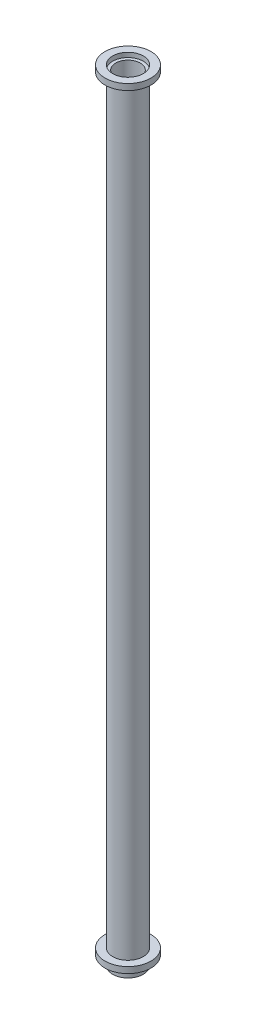
ISO-10303-21;
HEADER;
FILE_DESCRIPTION(('STEP AP214'),'2;1');
FILE_NAME('part.step','',(''),(''),'','','');
FILE_SCHEMA(('AUTOMOTIVE_DESIGN { 1 0 10303 214 1 1 1 1 }'));
ENDSEC;
DATA;
#1=APPLICATION_CONTEXT('core data for automotive mechanical design processes');
#2=APPLICATION_PROTOCOL_DEFINITION('international standard','automotive_design',2000,#1);
#3=PRODUCT_CONTEXT('',#1,'mechanical');
#4=PRODUCT('Part','Part','',(#3));
#5=PRODUCT_RELATED_PRODUCT_CATEGORY('part','',(#4));
#6=PRODUCT_DEFINITION_FORMATION('','',#4);
#7=PRODUCT_DEFINITION_CONTEXT('part definition',#1,'design');
#8=PRODUCT_DEFINITION('design','',#6,#7);
#9=PRODUCT_DEFINITION_SHAPE('','',#8);
#10=(LENGTH_UNIT() NAMED_UNIT(*) SI_UNIT(.MILLI.,.METRE.));
#11=(NAMED_UNIT(*) PLANE_ANGLE_UNIT() SI_UNIT($,.RADIAN.));
#12=(NAMED_UNIT(*) SI_UNIT($,.STERADIAN.) SOLID_ANGLE_UNIT());
#13=UNCERTAINTY_MEASURE_WITH_UNIT(LENGTH_MEASURE(1.E-05),#10,'distance_accuracy_value','');
#14=(GEOMETRIC_REPRESENTATION_CONTEXT(3) GLOBAL_UNCERTAINTY_ASSIGNED_CONTEXT((#13)) GLOBAL_UNIT_ASSIGNED_CONTEXT((#10,
#11,#12)) REPRESENTATION_CONTEXT('',''));
#15=CARTESIAN_POINT('',(0.,0.,0.));
#16=DIRECTION('',(0.,0.,1.));
#17=DIRECTION('',(1.,0.,0.));
#18=AXIS2_PLACEMENT_3D('',#15,#16,#17);
#19=CARTESIAN_POINT('',(0.,506.,0.));
#20=DIRECTION('',(0.,-1.,0.));
#21=DIRECTION('',(0.,0.,-1.));
#22=AXIS2_PLACEMENT_3D('',#19,#20,#21);
#23=CYLINDRICAL_SURFACE('',#22,10.);
#24=CARTESIAN_POINT('',(0.,0.,0.));
#25=DIRECTION('',(0.,1.,0.));
#26=DIRECTION('',(0.,0.,1.));
#27=AXIS2_PLACEMENT_3D('',#24,#25,#26);
#28=CIRCLE('',#27,10.);
#29=CARTESIAN_POINT('',(0.,0.,10.));
#30=VERTEX_POINT('',#29);
#31=EDGE_CURVE('E58',#30,#30,#28,.T.);
#32=ORIENTED_EDGE('',*,*,#31,.T.);
#33=EDGE_LOOP('',(#32));
#34=FACE_BOUND('',#33,.T.);
#35=CARTESIAN_POINT('',(0.,6.00000000000001,0.));
#36=DIRECTION('',(0.,1.,0.));
#37=DIRECTION('',(0.,0.,1.));
#38=AXIS2_PLACEMENT_3D('',#35,#36,#37);
#39=CIRCLE('',#38,10.);
#40=CARTESIAN_POINT('',(0.,6.00000000000001,10.));
#41=VERTEX_POINT('',#40);
#42=EDGE_CURVE('E10',#41,#41,#39,.T.);
#43=ORIENTED_EDGE('',*,*,#42,.F.);
#44=EDGE_LOOP('',(#43));
#45=FACE_BOUND('',#44,.T.);
#46=ADVANCED_FACE('F45',(#34,#45),#23,.T.);
#47=CARTESIAN_POINT('',(0.,10.,0.));
#48=DIRECTION('',(0.,1.,0.));
#49=DIRECTION('',(0.,0.,1.));
#50=AXIS2_PLACEMENT_3D('',#47,#48,#49);
#51=CIRCLE('',#50,10.);
#52=CARTESIAN_POINT('',(0.,10.,10.));
#53=VERTEX_POINT('',#52);
#54=EDGE_CURVE('E97',#53,#53,#51,.T.);
#55=ORIENTED_EDGE('',*,*,#54,.T.);
#56=EDGE_LOOP('',(#55));
#57=FACE_BOUND('',#56,.T.);
#58=CARTESIAN_POINT('',(0.,505.,0.));
#59=DIRECTION('',(0.,1.,0.));
#60=DIRECTION('',(0.,0.,1.));
#61=AXIS2_PLACEMENT_3D('',#58,#59,#60);
#62=CIRCLE('',#61,10.);
#63=CARTESIAN_POINT('',(0.,505.,10.));
#64=VERTEX_POINT('',#63);
#65=EDGE_CURVE('E53',#64,#64,#62,.T.);
#66=ORIENTED_EDGE('',*,*,#65,.F.);
#67=EDGE_LOOP('',(#66));
#68=FACE_BOUND('',#67,.T.);
#69=ADVANCED_FACE('F47',(#57,#68),#23,.T.);
#70=CARTESIAN_POINT('',(0.,506.,0.));
#71=DIRECTION('',(0.,1.,0.));
#72=DIRECTION('',(0.,0.,1.));
#73=AXIS2_PLACEMENT_3D('',#70,#71,#72);
#74=PLANE('',#73);
#75=CARTESIAN_POINT('',(0.,506.,0.));
#76=DIRECTION('',(0.,1.,0.));
#77=DIRECTION('',(0.,0.,1.));
#78=AXIS2_PLACEMENT_3D('',#75,#76,#77);
#79=CIRCLE('',#78,8.);
#80=CARTESIAN_POINT('',(0.,506.,8.));
#81=VERTEX_POINT('',#80);
#82=EDGE_CURVE('E63',#81,#81,#79,.T.);
#83=ORIENTED_EDGE('',*,*,#82,.F.);
#84=EDGE_LOOP('',(#83));
#85=FACE_BOUND('',#84,.T.);
#86=CARTESIAN_POINT('',(0.,506.,0.));
#87=DIRECTION('',(0.,1.,0.));
#88=DIRECTION('',(0.,0.,1.));
#89=AXIS2_PLACEMENT_3D('',#86,#87,#88);
#90=CIRCLE('',#89,10.);
#91=CARTESIAN_POINT('',(0.,506.,10.));
#92=VERTEX_POINT('',#91);
#93=EDGE_CURVE('E70',#92,#92,#90,.T.);
#94=ORIENTED_EDGE('',*,*,#93,.T.);
#95=EDGE_LOOP('',(#94));
#96=FACE_BOUND('',#95,.T.);
#97=ADVANCED_FACE('F119',(#85,#96),#74,.T.);
#98=CARTESIAN_POINT('',(0.,0.,0.));
#99=DIRECTION('',(0.,1.,0.));
#100=DIRECTION('',(0.,0.,1.));
#101=AXIS2_PLACEMENT_3D('',#98,#99,#100);
#102=PLANE('',#101);
#103=CARTESIAN_POINT('',(0.,0.,0.));
#104=DIRECTION('',(0.,1.,0.));
#105=DIRECTION('',(0.,0.,1.));
#106=AXIS2_PLACEMENT_3D('',#103,#104,#105);
#107=CIRCLE('',#106,8.);
#108=CARTESIAN_POINT('',(0.,0.,8.));
#109=VERTEX_POINT('',#108);
#110=EDGE_CURVE('E66',#109,#109,#107,.T.);
#111=ORIENTED_EDGE('',*,*,#110,.T.);
#112=EDGE_LOOP('',(#111));
#113=FACE_BOUND('',#112,.T.);
#114=ORIENTED_EDGE('',*,*,#31,.F.);
#115=EDGE_LOOP('',(#114));
#116=FACE_BOUND('',#115,.T.);
#117=ADVANCED_FACE('F123',(#113,#116),#102,.F.);
#118=CARTESIAN_POINT('',(0.,506.,0.));
#119=DIRECTION('',(0.,-1.,0.));
#120=DIRECTION('',(0.,0.,-1.));
#121=AXIS2_PLACEMENT_3D('',#118,#119,#120);
#122=CYLINDRICAL_SURFACE('',#121,8.);
#123=ORIENTED_EDGE('',*,*,#82,.T.);
#124=EDGE_LOOP('',(#123));
#125=FACE_BOUND('',#124,.T.);
#126=ORIENTED_EDGE('',*,*,#110,.F.);
#127=EDGE_LOOP('',(#126));
#128=FACE_BOUND('',#127,.T.);
#129=ADVANCED_FACE('F125',(#125,#128),#122,.F.);
#130=CARTESIAN_POINT('',(0.,505.,0.));
#131=DIRECTION('',(0.,1.,0.));
#132=DIRECTION('',(0.,0.,1.));
#133=AXIS2_PLACEMENT_3D('',#130,#131,#132);
#134=CYLINDRICAL_SURFACE('',#133,15.);
#135=CARTESIAN_POINT('',(0.,505.,0.));
#136=DIRECTION('',(0.,1.,0.));
#137=DIRECTION('',(0.,0.,1.));
#138=AXIS2_PLACEMENT_3D('',#135,#136,#137);
#139=CIRCLE('',#138,15.);
#140=CARTESIAN_POINT('',(0.,505.,15.));
#141=VERTEX_POINT('',#140);
#142=EDGE_CURVE('E77',#141,#141,#139,.T.);
#143=ORIENTED_EDGE('',*,*,#142,.T.);
#144=EDGE_LOOP('',(#143));
#145=FACE_BOUND('',#144,.T.);
#146=CARTESIAN_POINT('',(0.,509.,0.));
#147=DIRECTION('',(0.,1.,0.));
#148=DIRECTION('',(0.,0.,1.));
#149=AXIS2_PLACEMENT_3D('',#146,#147,#148);
#150=CIRCLE('',#149,15.);
#151=CARTESIAN_POINT('',(0.,509.,15.));
#152=VERTEX_POINT('',#151);
#153=EDGE_CURVE('E81',#152,#152,#150,.T.);
#154=ORIENTED_EDGE('',*,*,#153,.F.);
#155=EDGE_LOOP('',(#154));
#156=FACE_BOUND('',#155,.T.);
#157=ADVANCED_FACE('F131',(#145,#156),#134,.T.);
#158=CARTESIAN_POINT('',(0.,505.,0.));
#159=DIRECTION('',(0.,1.,0.));
#160=DIRECTION('',(0.,0.,1.));
#161=AXIS2_PLACEMENT_3D('',#158,#159,#160);
#162=PLANE('',#161);
#163=ORIENTED_EDGE('',*,*,#65,.T.);
#164=EDGE_LOOP('',(#163));
#165=FACE_BOUND('',#164,.T.);
#166=ORIENTED_EDGE('',*,*,#142,.F.);
#167=EDGE_LOOP('',(#166));
#168=FACE_BOUND('',#167,.T.);
#169=ADVANCED_FACE('F139',(#165,#168),#162,.F.);
#170=CARTESIAN_POINT('',(0.,505.,0.));
#171=DIRECTION('',(0.,1.,0.));
#172=DIRECTION('',(0.,0.,1.));
#173=AXIS2_PLACEMENT_3D('',#170,#171,#172);
#174=CYLINDRICAL_SURFACE('',#173,10.);
#175=ORIENTED_EDGE('',*,*,#93,.F.);
#176=EDGE_LOOP('',(#175));
#177=FACE_BOUND('',#176,.T.);
#178=CARTESIAN_POINT('',(0.,509.,0.));
#179=DIRECTION('',(0.,1.,0.));
#180=DIRECTION('',(0.,0.,1.));
#181=AXIS2_PLACEMENT_3D('',#178,#179,#180);
#182=CIRCLE('',#181,10.);
#183=CARTESIAN_POINT('',(0.,509.,10.));
#184=VERTEX_POINT('',#183);
#185=EDGE_CURVE('E85',#184,#184,#182,.T.);
#186=ORIENTED_EDGE('',*,*,#185,.T.);
#187=EDGE_LOOP('',(#186));
#188=FACE_BOUND('',#187,.T.);
#189=ADVANCED_FACE('F143',(#177,#188),#174,.F.);
#190=CARTESIAN_POINT('',(0.,509.,0.));
#191=DIRECTION('',(0.,1.,0.));
#192=DIRECTION('',(0.,0.,1.));
#193=AXIS2_PLACEMENT_3D('',#190,#191,#192);
#194=PLANE('',#193);
#195=ORIENTED_EDGE('',*,*,#153,.T.);
#196=EDGE_LOOP('',(#195));
#197=FACE_BOUND('',#196,.T.);
#198=ORIENTED_EDGE('',*,*,#185,.F.);
#199=EDGE_LOOP('',(#198));
#200=FACE_BOUND('',#199,.T.);
#201=ADVANCED_FACE('F146',(#197,#200),#194,.T.);
#202=CARTESIAN_POINT('',(0.,6.00000000000001,0.));
#203=DIRECTION('',(0.,1.,0.));
#204=DIRECTION('',(0.,0.,1.));
#205=AXIS2_PLACEMENT_3D('',#202,#203,#204);
#206=CYLINDRICAL_SURFACE('',#205,15.);
#207=CARTESIAN_POINT('',(0.,6.00000000000001,0.));
#208=DIRECTION('',(0.,1.,0.));
#209=DIRECTION('',(0.,0.,1.));
#210=AXIS2_PLACEMENT_3D('',#207,#208,#209);
#211=CIRCLE('',#210,15.);
#212=CARTESIAN_POINT('',(0.,6.00000000000001,15.));
#213=VERTEX_POINT('',#212);
#214=EDGE_CURVE('E89',#213,#213,#211,.T.);
#215=ORIENTED_EDGE('',*,*,#214,.T.);
#216=EDGE_LOOP('',(#215));
#217=FACE_BOUND('',#216,.T.);
#218=CARTESIAN_POINT('',(0.,10.,0.));
#219=DIRECTION('',(0.,1.,0.));
#220=DIRECTION('',(0.,0.,1.));
#221=AXIS2_PLACEMENT_3D('',#218,#219,#220);
#222=CIRCLE('',#221,15.);
#223=CARTESIAN_POINT('',(0.,10.,15.));
#224=VERTEX_POINT('',#223);
#225=EDGE_CURVE('E93',#224,#224,#222,.T.);
#226=ORIENTED_EDGE('',*,*,#225,.F.);
#227=EDGE_LOOP('',(#226));
#228=FACE_BOUND('',#227,.T.);
#229=ADVANCED_FACE('F112',(#217,#228),#206,.T.);
#230=CARTESIAN_POINT('',(0.,6.00000000000001,0.));
#231=DIRECTION('',(0.,1.,0.));
#232=DIRECTION('',(0.,0.,1.));
#233=AXIS2_PLACEMENT_3D('',#230,#231,#232);
#234=PLANE('',#233);
#235=ORIENTED_EDGE('',*,*,#42,.T.);
#236=EDGE_LOOP('',(#235));
#237=FACE_BOUND('',#236,.T.);
#238=ORIENTED_EDGE('',*,*,#214,.F.);
#239=EDGE_LOOP('',(#238));
#240=FACE_BOUND('',#239,.T.);
#241=ADVANCED_FACE('F106',(#237,#240),#234,.F.);
#242=CARTESIAN_POINT('',(0.,10.,0.));
#243=DIRECTION('',(0.,1.,0.));
#244=DIRECTION('',(0.,0.,1.));
#245=AXIS2_PLACEMENT_3D('',#242,#243,#244);
#246=PLANE('',#245);
#247=ORIENTED_EDGE('',*,*,#225,.T.);
#248=EDGE_LOOP('',(#247));
#249=FACE_BOUND('',#248,.T.);
#250=ORIENTED_EDGE('',*,*,#54,.F.);
#251=EDGE_LOOP('',(#250));
#252=FACE_BOUND('',#251,.T.);
#253=ADVANCED_FACE('F104',(#249,#252),#246,.T.);
#254=CLOSED_SHELL('',(#46,#69,#97,#117,#129,#157,#169,#189,#201,#229,#241,#253));
#255=MANIFOLD_SOLID_BREP('B2',#254);
#256=ADVANCED_BREP_SHAPE_REPRESENTATION('',(#18,#255),#14);
#257=SHAPE_DEFINITION_REPRESENTATION(#9,#256);
ENDSEC;
END-ISO-10303-21;
